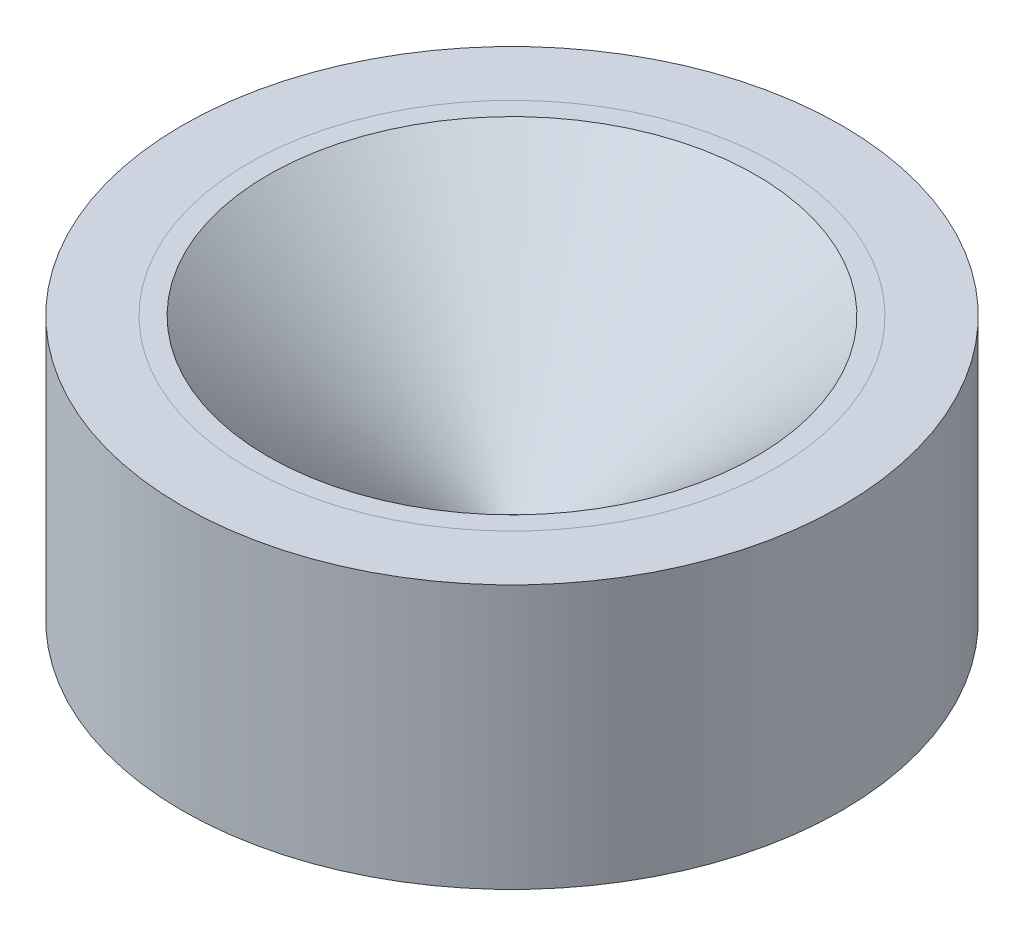
ISO-10303-21;
HEADER;
FILE_DESCRIPTION(('STEP AP214'),'2;1');
FILE_NAME('part.step','',(''),(''),'','','');
FILE_SCHEMA(('AUTOMOTIVE_DESIGN { 1 0 10303 214 1 1 1 1 }'));
ENDSEC;
DATA;
#1=APPLICATION_CONTEXT('core data for automotive mechanical design processes');
#2=APPLICATION_PROTOCOL_DEFINITION('international standard','automotive_design',2000,#1);
#3=PRODUCT_CONTEXT('',#1,'mechanical');
#4=PRODUCT('Part','Part','',(#3));
#5=PRODUCT_RELATED_PRODUCT_CATEGORY('part','',(#4));
#6=PRODUCT_DEFINITION_FORMATION('','',#4);
#7=PRODUCT_DEFINITION_CONTEXT('part definition',#1,'design');
#8=PRODUCT_DEFINITION('design','',#6,#7);
#9=PRODUCT_DEFINITION_SHAPE('','',#8);
#10=(LENGTH_UNIT() NAMED_UNIT(*) SI_UNIT(.MILLI.,.METRE.));
#11=(NAMED_UNIT(*) PLANE_ANGLE_UNIT() SI_UNIT($,.RADIAN.));
#12=(NAMED_UNIT(*) SI_UNIT($,.STERADIAN.) SOLID_ANGLE_UNIT());
#13=UNCERTAINTY_MEASURE_WITH_UNIT(LENGTH_MEASURE(1.E-05),#10,'distance_accuracy_value','');
#14=(GEOMETRIC_REPRESENTATION_CONTEXT(3) GLOBAL_UNCERTAINTY_ASSIGNED_CONTEXT((#13)) GLOBAL_UNIT_ASSIGNED_CONTEXT((#10,
#11,#12)) REPRESENTATION_CONTEXT('',''));
#15=CARTESIAN_POINT('',(0.,0.,0.));
#16=DIRECTION('',(0.,0.,1.));
#17=DIRECTION('',(1.,0.,0.));
#18=AXIS2_PLACEMENT_3D('',#15,#16,#17);
#19=CARTESIAN_POINT('',(0.,1.,0.));
#20=DIRECTION('',(0.,-1.,0.));
#21=DIRECTION('',(0.,0.,-1.));
#22=AXIS2_PLACEMENT_3D('',#19,#20,#21);
#23=CYLINDRICAL_SURFACE('',#22,0.625);
#24=CARTESIAN_POINT('',(0.,1.,0.));
#25=DIRECTION('',(0.,1.,0.));
#26=DIRECTION('',(0.,0.,1.));
#27=AXIS2_PLACEMENT_3D('',#24,#25,#26);
#28=CIRCLE('',#27,0.625);
#29=CARTESIAN_POINT('',(0.,1.,0.625));
#30=VERTEX_POINT('',#29);
#31=EDGE_CURVE('E61',#30,#30,#28,.T.);
#32=ORIENTED_EDGE('',*,*,#31,.F.);
#33=EDGE_LOOP('',(#32));
#34=FACE_BOUND('',#33,.T.);
#35=CARTESIAN_POINT('',(0.,0.,0.));
#36=DIRECTION('',(0.,-1.,0.));
#37=DIRECTION('',(0.,0.,-1.));
#38=AXIS2_PLACEMENT_3D('',#35,#36,#37);
#39=CIRCLE('',#38,0.625);
#40=CARTESIAN_POINT('',(0.,0.,-0.625));
#41=VERTEX_POINT('',#40);
#42=EDGE_CURVE('E12',#41,#41,#39,.T.);
#43=ORIENTED_EDGE('',*,*,#42,.F.);
#44=EDGE_LOOP('',(#43));
#45=FACE_BOUND('',#44,.T.);
#46=ADVANCED_FACE('F57',(#34,#45),#23,.T.);
#47=CARTESIAN_POINT('',(0.,0.,0.));
#48=DIRECTION('',(0.,-1.,0.));
#49=DIRECTION('',(0.,0.,-1.));
#50=AXIS2_PLACEMENT_3D('',#47,#48,#49);
#51=PLANE('',#50);
#52=CARTESIAN_POINT('',(0.,0.,0.));
#53=DIRECTION('',(0.,-1.,0.));
#54=DIRECTION('',(0.,0.,-1.));
#55=AXIS2_PLACEMENT_3D('',#52,#53,#54);
#56=CIRCLE('',#55,0.5);
#57=CARTESIAN_POINT('',(0.,0.,-0.5));
#58=VERTEX_POINT('',#57);
#59=EDGE_CURVE('E71',#58,#58,#56,.T.);
#60=ORIENTED_EDGE('',*,*,#59,.F.);
#61=EDGE_LOOP('',(#60));
#62=FACE_BOUND('',#61,.T.);
#63=ORIENTED_EDGE('',*,*,#42,.T.);
#64=EDGE_LOOP('',(#63));
#65=FACE_BOUND('',#64,.T.);
#66=ADVANCED_FACE('F160',(#62,#65),#51,.T.);
#67=CARTESIAN_POINT('',(0.,1.,0.));
#68=DIRECTION('',(0.,-1.,0.));
#69=DIRECTION('',(0.,0.,-1.));
#70=AXIS2_PLACEMENT_3D('',#67,#68,#69);
#71=CYLINDRICAL_SURFACE('',#70,0.5);
#72=CARTESIAN_POINT('',(0.,1.,0.));
#73=DIRECTION('',(0.,-1.,0.));
#74=DIRECTION('',(0.,0.,-1.));
#75=AXIS2_PLACEMENT_3D('',#72,#73,#74);
#76=CIRCLE('',#75,0.5);
#77=CARTESIAN_POINT('',(0.,1.,-0.5));
#78=VERTEX_POINT('',#77);
#79=EDGE_CURVE('E66',#78,#78,#76,.T.);
#80=ORIENTED_EDGE('',*,*,#79,.F.);
#81=EDGE_LOOP('',(#80));
#82=FACE_BOUND('',#81,.T.);
#83=ORIENTED_EDGE('',*,*,#59,.T.);
#84=EDGE_LOOP('',(#83));
#85=FACE_BOUND('',#84,.T.);
#86=ADVANCED_FACE('F165',(#82,#85),#71,.F.);
#87=CARTESIAN_POINT('',(0.,1.,0.));
#88=DIRECTION('',(0.,1.,0.));
#89=DIRECTION('',(0.,0.,1.));
#90=AXIS2_PLACEMENT_3D('',#87,#88,#89);
#91=PLANE('',#90);
#92=CARTESIAN_POINT('',(0.,1.,0.));
#93=DIRECTION('',(0.,1.,0.));
#94=DIRECTION('',(0.,0.,1.));
#95=AXIS2_PLACEMENT_3D('',#92,#93,#94);
#96=CIRCLE('',#95,0.425);
#97=CARTESIAN_POINT('',(0.,1.,0.425));
#98=VERTEX_POINT('',#97);
#99=EDGE_CURVE('E91',#98,#98,#96,.T.);
#100=ORIENTED_EDGE('',*,*,#99,.T.);
#101=EDGE_LOOP('',(#100));
#102=FACE_BOUND('',#101,.T.);
#103=ORIENTED_EDGE('',*,*,#79,.T.);
#104=EDGE_LOOP('',(#103));
#105=FACE_BOUND('',#104,.T.);
#106=ADVANCED_FACE('F118',(#102,#105),#91,.F.);
#107=CARTESIAN_POINT('',(0.,4.,0.));
#108=DIRECTION('',(0.,1.,0.));
#109=DIRECTION('',(0.,0.,1.));
#110=AXIS2_PLACEMENT_3D('',#107,#108,#109);
#111=PLANE('',#110);
#112=CARTESIAN_POINT('',(0.,4.,0.));
#113=DIRECTION('',(0.,1.,0.));
#114=DIRECTION('',(0.,0.,1.));
#115=AXIS2_PLACEMENT_3D('',#112,#113,#114);
#116=CIRCLE('',#115,3.69896013553019);
#117=CARTESIAN_POINT('',(0.,4.,3.69896013553019));
#118=VERTEX_POINT('',#117);
#119=EDGE_CURVE('E146',#118,#118,#116,.T.);
#120=ORIENTED_EDGE('',*,*,#119,.F.);
#121=EDGE_LOOP('',(#120));
#122=FACE_BOUND('',#121,.T.);
#123=CARTESIAN_POINT('',(0.,4.,0.));
#124=DIRECTION('',(0.,1.,0.));
#125=DIRECTION('',(0.,0.,1.));
#126=AXIS2_PLACEMENT_3D('',#123,#124,#125);
#127=CIRCLE('',#126,4.);
#128=CARTESIAN_POINT('',(0.,4.,4.));
#129=VERTEX_POINT('',#128);
#130=EDGE_CURVE('E88',#129,#129,#127,.T.);
#131=ORIENTED_EDGE('',*,*,#130,.T.);
#132=EDGE_LOOP('',(#131));
#133=FACE_BOUND('',#132,.T.);
#134=ADVANCED_FACE('F107',(#122,#133),#111,.T.);
#135=CARTESIAN_POINT('',(0.,1.,0.));
#136=DIRECTION('',(0.,1.,0.));
#137=DIRECTION('',(0.,0.,1.));
#138=AXIS2_PLACEMENT_3D('',#135,#136,#137);
#139=CONICAL_SURFACE('',#138,0.625,0.844153986113171);
#140=CARTESIAN_POINT('',(0.,4.,4.));
#141=CARTESIAN_POINT('',(0.,3.96875,3.96484375));
#142=CARTESIAN_POINT('',(0.,3.9375,3.9296875));
#143=CARTESIAN_POINT('',(0.,3.875,3.859375));
#144=CARTESIAN_POINT('',(0.,3.84375,3.82421875));
#145=CARTESIAN_POINT('',(0.,3.78125,3.75390625));
#146=CARTESIAN_POINT('',(0.,3.75,3.71875));
#147=CARTESIAN_POINT('',(0.,3.6875,3.6484375));
#148=CARTESIAN_POINT('',(0.,3.65625,3.61328125));
#149=CARTESIAN_POINT('',(0.,3.59375,3.54296875));
#150=CARTESIAN_POINT('',(0.,3.5625,3.5078125));
#151=CARTESIAN_POINT('',(0.,3.5,3.4375));
#152=CARTESIAN_POINT('',(0.,3.46875,3.40234375));
#153=CARTESIAN_POINT('',(0.,3.40625,3.33203125));
#154=CARTESIAN_POINT('',(0.,3.375,3.296875));
#155=CARTESIAN_POINT('',(0.,3.3125,3.2265625));
#156=CARTESIAN_POINT('',(0.,3.28125,3.19140625));
#157=CARTESIAN_POINT('',(0.,3.21875,3.12109375));
#158=CARTESIAN_POINT('',(0.,3.1875,3.0859375));
#159=CARTESIAN_POINT('',(0.,3.125,3.015625));
#160=CARTESIAN_POINT('',(0.,3.09375,2.98046875));
#161=CARTESIAN_POINT('',(0.,3.03125,2.91015625));
#162=CARTESIAN_POINT('',(0.,3.,2.875));
#163=CARTESIAN_POINT('',(0.,2.9375,2.8046875));
#164=CARTESIAN_POINT('',(0.,2.90625,2.76953125));
#165=CARTESIAN_POINT('',(0.,2.84375,2.69921875));
#166=CARTESIAN_POINT('',(0.,2.8125,2.6640625));
#167=CARTESIAN_POINT('',(0.,2.75,2.59375));
#168=CARTESIAN_POINT('',(0.,2.71875,2.55859375));
#169=CARTESIAN_POINT('',(0.,2.65625,2.48828125));
#170=CARTESIAN_POINT('',(0.,2.625,2.453125));
#171=CARTESIAN_POINT('',(0.,2.5625,2.3828125));
#172=CARTESIAN_POINT('',(0.,2.53125,2.34765625));
#173=CARTESIAN_POINT('',(0.,2.46875,2.27734375));
#174=CARTESIAN_POINT('',(0.,2.4375,2.2421875));
#175=CARTESIAN_POINT('',(0.,2.375,2.171875));
#176=CARTESIAN_POINT('',(0.,2.34375,2.13671875));
#177=CARTESIAN_POINT('',(0.,2.28125,2.06640625));
#178=CARTESIAN_POINT('',(0.,2.25,2.03125));
#179=CARTESIAN_POINT('',(0.,2.1875,1.9609375));
#180=CARTESIAN_POINT('',(0.,2.15625,1.92578125));
#181=CARTESIAN_POINT('',(0.,2.09375,1.85546875));
#182=CARTESIAN_POINT('',(0.,2.0625,1.8203125));
#183=CARTESIAN_POINT('',(0.,2.,1.75));
#184=CARTESIAN_POINT('',(0.,1.96875,1.71484375));
#185=CARTESIAN_POINT('',(0.,1.90625,1.64453125));
#186=CARTESIAN_POINT('',(0.,1.875,1.609375));
#187=CARTESIAN_POINT('',(0.,1.8125,1.5390625));
#188=CARTESIAN_POINT('',(0.,1.78125,1.50390625));
#189=CARTESIAN_POINT('',(0.,1.71875,1.43359375));
#190=CARTESIAN_POINT('',(0.,1.6875,1.3984375));
#191=CARTESIAN_POINT('',(0.,1.625,1.328125));
#192=CARTESIAN_POINT('',(0.,1.59375,1.29296875));
#193=CARTESIAN_POINT('',(0.,1.53125,1.22265625));
#194=CARTESIAN_POINT('',(0.,1.5,1.1875));
#195=CARTESIAN_POINT('',(0.,1.4375,1.1171875));
#196=CARTESIAN_POINT('',(0.,1.40625,1.08203125));
#197=CARTESIAN_POINT('',(0.,1.34375,1.01171875));
#198=CARTESIAN_POINT('',(0.,1.3125,0.9765625));
#199=CARTESIAN_POINT('',(0.,1.25,0.90625));
#200=CARTESIAN_POINT('',(0.,1.21875,0.87109375));
#201=CARTESIAN_POINT('',(0.,1.15625,0.80078125));
#202=CARTESIAN_POINT('',(0.,1.125,0.765625));
#203=CARTESIAN_POINT('',(0.,1.0625,0.6953125));
#204=CARTESIAN_POINT('',(0.,1.03125,0.66015625));
#205=CARTESIAN_POINT('',(0.,1.,0.625));
#206=B_SPLINE_CURVE_WITH_KNOTS('',3,(#140,#141,#142,#143,#144,#145,#146,#147,#148,#149,#150,
#151,#152,#153,#154,#155,#156,#157,#158,#159,#160,#161,#162,#163,#164,#165,#166,#167,#168,#169,
#170,#171,#172,#173,#174,#175,#176,#177,#178,#179,#180,#181,#182,#183,#184,#185,#186,#187,#188,
#189,#190,#191,#192,#193,#194,#195,#196,#197,#198,#199,#200,#201,#202,#203,#204,#205),
.UNSPECIFIED.,.F.,.F.,(4,2,2,2,2,2,2,2,2,2,2,2,2,2,2,2,2,2,2,2,2,2,2,2,2,2,2,2,2,2,2,2,4),(0.,
0.141112436470222,0.282224872940445,0.423337309410666,0.564449745880889,0.705562182351111,
0.846674618821333,0.987787055291555,1.12889949176178,1.270011928232,1.41112436470222,
1.55223680117244,1.69334923764267,1.83446167411289,1.97557411058311,2.11668654705333,
2.25779898352355,2.39891141999378,2.540023856464,2.68113629293422,2.82224872940444,
2.96336116587467,3.10447360234489,3.24558603881511,3.38669847528533,3.52781091175555,
3.66892334822578,3.810035784696,3.95114822116622,4.09226065763644,4.23337309410667,
4.37448553057689,4.51559796704711),.UNSPECIFIED.);
#207=EDGE_CURVE('BSEAM117',#129,#30,#206,.T.);
#208=ORIENTED_EDGE('',*,*,#130,.F.);
#209=ORIENTED_EDGE('',*,*,#31,.T.);
#210=ORIENTED_EDGE('',*,*,#207,.T.);
#211=ORIENTED_EDGE('',*,*,#207,.F.);
#212=EDGE_LOOP('',(#208,#210,#209,#211));
#213=FACE_BOUND('',#212,.T.);
#214=ADVANCED_FACE('F117',(#213),#139,.T.);
#215=CARTESIAN_POINT('',(0.,1.,0.));
#216=DIRECTION('',(0.,-1.,0.));
#217=DIRECTION('',(0.,0.,-1.));
#218=AXIS2_PLACEMENT_3D('',#215,#216,#217);
#219=CYLINDRICAL_SURFACE('',#218,0.425);
#220=CARTESIAN_POINT('',(0.,1.08981321286205,0.));
#221=DIRECTION('',(0.,1.,0.));
#222=DIRECTION('',(0.,0.,1.));
#223=AXIS2_PLACEMENT_3D('',#220,#221,#222);
#224=CIRCLE('',#223,0.425);
#225=CARTESIAN_POINT('',(0.,1.08981321286205,0.425));
#226=VERTEX_POINT('',#225);
#227=EDGE_CURVE('E97',#226,#226,#224,.T.);
#228=ORIENTED_EDGE('',*,*,#227,.T.);
#229=EDGE_LOOP('',(#228));
#230=FACE_BOUND('',#229,.T.);
#231=ORIENTED_EDGE('',*,*,#99,.F.);
#232=EDGE_LOOP('',(#231));
#233=FACE_BOUND('',#232,.T.);
#234=ADVANCED_FACE('F125',(#230,#233),#219,.F.);
#235=CARTESIAN_POINT('',(0.,1.14948186373673,0.));
#236=DIRECTION('',(0.,1.,0.));
#237=DIRECTION('',(0.,0.,1.));
#238=AXIS2_PLACEMENT_3D('',#235,#236,#237);
#239=CONICAL_SURFACE('',#238,0.492127232234016,0.844153986113171);
#240=CARTESIAN_POINT('',(0.,4.,3.69896013553019));
#241=CARTESIAN_POINT('',(0.,3.96968555430065,3.66485638411842));
#242=CARTESIAN_POINT('',(0.,3.93937110860129,3.63075263270665));
#243=CARTESIAN_POINT('',(0.,3.87874221720259,3.5625451298831));
#244=CARTESIAN_POINT('',(0.,3.84842777150323,3.52844137847133));
#245=CARTESIAN_POINT('',(0.,3.78779888010452,3.46023387564778));
#246=CARTESIAN_POINT('',(0.,3.75748443440517,3.42613012423601));
#247=CARTESIAN_POINT('',(0.,3.69685554300646,3.35792262141246));
#248=CARTESIAN_POINT('',(0.,3.66654109730711,3.32381887000069));
#249=CARTESIAN_POINT('',(0.,3.6059122059084,3.25561136717715));
#250=CARTESIAN_POINT('',(0.,3.57559776020905,3.22150761576537));
#251=CARTESIAN_POINT('',(0.,3.51496886881034,3.15330011294183));
#252=CARTESIAN_POINT('',(0.,3.48465442311099,3.11919636153005));
#253=CARTESIAN_POINT('',(0.,3.42402553171228,3.05098885870651));
#254=CARTESIAN_POINT('',(0.,3.39371108601293,3.01688510729474));
#255=CARTESIAN_POINT('',(0.,3.33308219461422,2.94867760447119));
#256=CARTESIAN_POINT('',(0.,3.30276774891487,2.91457385305942));
#257=CARTESIAN_POINT('',(0.,3.24213885751616,2.84636635023587));
#258=CARTESIAN_POINT('',(0.,3.21182441181681,2.8122625988241));
#259=CARTESIAN_POINT('',(0.,3.1511955204181,2.74405509600055));
#260=CARTESIAN_POINT('',(0.,3.12088107471874,2.70995134458878));
#261=CARTESIAN_POINT('',(0.,3.06025218332004,2.64174384176523));
#262=CARTESIAN_POINT('',(0.,3.02993773762068,2.60764009035346));
#263=CARTESIAN_POINT('',(0.,2.96930884622198,2.53943258752992));
#264=CARTESIAN_POINT('',(0.,2.93899440052262,2.50532883611814));
#265=CARTESIAN_POINT('',(0.,2.87836550912392,2.4371213332946));
#266=CARTESIAN_POINT('',(0.,2.84805106342456,2.40301758188282));
#267=CARTESIAN_POINT('',(0.,2.78742217202585,2.33481007905928));
#268=CARTESIAN_POINT('',(0.,2.7571077263265,2.30070632764751));
#269=CARTESIAN_POINT('',(0.,2.69647883492779,2.23249882482396));
#270=CARTESIAN_POINT('',(0.,2.66616438922844,2.19839507341219));
#271=CARTESIAN_POINT('',(0.,2.60553549782973,2.13018757058864));
#272=CARTESIAN_POINT('',(0.,2.57522105213038,2.09608381917687));
#273=CARTESIAN_POINT('',(0.,2.51459216073167,2.02787631635332));
#274=CARTESIAN_POINT('',(0.,2.48427771503232,1.99377256494155));
#275=CARTESIAN_POINT('',(0.,2.42364882363361,1.925565062118));
#276=CARTESIAN_POINT('',(0.,2.39333437793426,1.89146131070623));
#277=CARTESIAN_POINT('',(0.,2.33270548653555,1.82325380788269));
#278=CARTESIAN_POINT('',(0.,2.3023910408362,1.78915005647091));
#279=CARTESIAN_POINT('',(0.,2.24176214943749,1.72094255364737));
#280=CARTESIAN_POINT('',(0.,2.21144770373814,1.68683880223559));
#281=CARTESIAN_POINT('',(0.,2.15081881233943,1.61863129941205));
#282=CARTESIAN_POINT('',(0.,2.12050436664007,1.58452754800028));
#283=CARTESIAN_POINT('',(0.,2.05987547524137,1.51632004517673));
#284=CARTESIAN_POINT('',(0.,2.02956102954201,1.48221629376496));
#285=CARTESIAN_POINT('',(0.,1.96893213814331,1.41400879094141));
#286=CARTESIAN_POINT('',(0.,1.93861769244395,1.37990503952964));
#287=CARTESIAN_POINT('',(0.,1.87798880104525,1.31169753670609));
#288=CARTESIAN_POINT('',(0.,1.84767435534589,1.27759378529432));
#289=CARTESIAN_POINT('',(0.,1.78704546394718,1.20938628247078));
#290=CARTESIAN_POINT('',(0.,1.75673101824783,1.175282531059));
#291=CARTESIAN_POINT('',(0.,1.69610212684912,1.10707502823546));
#292=CARTESIAN_POINT('',(0.,1.66578768114977,1.07297127682368));
#293=CARTESIAN_POINT('',(0.,1.60515878975106,1.00476377400014));
#294=CARTESIAN_POINT('',(0.,1.57484434405171,0.970660022588365));
#295=CARTESIAN_POINT('',(0.,1.514215452653,0.90245251976482));
#296=CARTESIAN_POINT('',(0.,1.48390100695365,0.868348768353047));
#297=CARTESIAN_POINT('',(0.,1.42327211555494,0.800141265529501));
#298=CARTESIAN_POINT('',(0.,1.39295766985559,0.766037514117728));
#299=CARTESIAN_POINT('',(0.,1.33232877845688,0.697830011294182));
#300=CARTESIAN_POINT('',(0.,1.30201433275753,0.66372625988241));
#301=CARTESIAN_POINT('',(0.,1.24138544135882,0.595518757058864));
#302=CARTESIAN_POINT('',(0.,1.21107099565947,0.561415005647091));
#303=CARTESIAN_POINT('',(0.,1.15044210426076,0.493207502823545));
#304=CARTESIAN_POINT('',(0.,1.1201276585614,0.459103751411773));
#305=CARTESIAN_POINT('',(0.,1.08981321286205,0.425));
#306=B_SPLINE_CURVE_WITH_KNOTS('',3,(#240,#241,#242,#243,#244,#245,#246,#247,#248,#249,#250,
#251,#252,#253,#254,#255,#256,#257,#258,#259,#260,#261,#262,#263,#264,#265,#266,#267,#268,#269,
#270,#271,#272,#273,#274,#275,#276,#277,#278,#279,#280,#281,#282,#283,#284,#285,#286,#287,#288,
#289,#290,#291,#292,#293,#294,#295,#296,#297,#298,#299,#300,#301,#302,#303,#304,#305),
.UNSPECIFIED.,.F.,.F.,(4,2,2,2,2,2,2,2,2,2,2,2,2,2,2,2,2,2,2,2,2,2,2,2,2,2,2,2,2,2,2,2,4),(0.,
0.136887849372161,0.273775698744322,0.410663548116484,0.547551397488645,0.684439246860807,
0.821327096232968,0.95821494560513,1.09510279497729,1.23199064434945,1.36887849372161,
1.50576634309377,1.64265419246594,1.7795420418381,1.91642989121026,2.05331774058242,
2.19020558995458,2.32709343932674,2.4639812886989,2.60086913807106,2.73775698744323,
2.87464483681539,3.01153268618755,3.14842053555971,3.28530838493187,3.42219623430403,
3.55908408367619,3.69597193304835,3.83285978242052,3.96974763179268,4.10663548116484,
4.243523330537,4.38041117990916),.UNSPECIFIED.);
#307=EDGE_CURVE('BSEAM120',#118,#226,#306,.T.);
#308=ORIENTED_EDGE('',*,*,#119,.T.);
#309=ORIENTED_EDGE('',*,*,#227,.F.);
#310=ORIENTED_EDGE('',*,*,#307,.T.);
#311=ORIENTED_EDGE('',*,*,#307,.F.);
#312=EDGE_LOOP('',(#308,#310,#309,#311));
#313=FACE_BOUND('',#312,.T.);
#314=ADVANCED_FACE('F120',(#313),#239,.F.);
#315=CLOSED_SHELL('',(#46,#66,#86,#106,#134,#214,#234,#314));
#316=MANIFOLD_SOLID_BREP('B2',#315);
#317=CARTESIAN_POINT('',(0.,4.,0.));
#318=DIRECTION('',(0.,1.,0.));
#319=DIRECTION('',(0.,0.,1.));
#320=AXIS2_PLACEMENT_3D('',#317,#318,#319);
#321=PLANE('',#320);
#322=CARTESIAN_POINT('',(0.,4.,0.));
#323=DIRECTION('',(0.,1.,0.));
#324=DIRECTION('',(0.,0.,1.));
#325=AXIS2_PLACEMENT_3D('',#322,#323,#324);
#326=CIRCLE('',#325,5.);
#327=CARTESIAN_POINT('',(0.,4.,5.));
#328=VERTEX_POINT('',#327);
#329=EDGE_CURVE('E238',#328,#328,#326,.T.);
#330=ORIENTED_EDGE('',*,*,#329,.T.);
#331=EDGE_LOOP('',(#330));
#332=FACE_BOUND('',#331,.T.);
#333=CARTESIAN_POINT('',(0.,4.,0.));
#334=DIRECTION('',(0.,1.,0.));
#335=DIRECTION('',(0.,0.,1.));
#336=AXIS2_PLACEMENT_3D('',#333,#334,#335);
#337=CIRCLE('',#336,4.);
#338=CARTESIAN_POINT('',(0.,4.,4.));
#339=VERTEX_POINT('',#338);
#340=EDGE_CURVE('E56',#339,#339,#337,.T.);
#341=ORIENTED_EDGE('',*,*,#340,.F.);
#342=EDGE_LOOP('',(#341));
#343=FACE_BOUND('',#342,.T.);
#344=ADVANCED_FACE('F223',(#332,#343),#321,.T.);
#345=CARTESIAN_POINT('',(0.,0.,0.));
#346=DIRECTION('',(0.,1.,0.));
#347=DIRECTION('',(0.,0.,1.));
#348=AXIS2_PLACEMENT_3D('',#345,#346,#347);
#349=PLANE('',#348);
#350=CARTESIAN_POINT('',(0.,0.,0.));
#351=DIRECTION('',(0.,1.,0.));
#352=DIRECTION('',(0.,0.,1.));
#353=AXIS2_PLACEMENT_3D('',#350,#351,#352);
#354=CIRCLE('',#353,5.);
#355=CARTESIAN_POINT('',(0.,0.,5.));
#356=VERTEX_POINT('',#355);
#357=EDGE_CURVE('E229',#356,#356,#354,.T.);
#358=ORIENTED_EDGE('',*,*,#357,.F.);
#359=EDGE_LOOP('',(#358));
#360=FACE_BOUND('',#359,.T.);
#361=CARTESIAN_POINT('',(0.,0.,0.));
#362=DIRECTION('',(0.,1.,0.));
#363=DIRECTION('',(0.,0.,1.));
#364=AXIS2_PLACEMENT_3D('',#361,#362,#363);
#365=CIRCLE('',#364,4.);
#366=CARTESIAN_POINT('',(0.,0.,4.));
#367=VERTEX_POINT('',#366);
#368=EDGE_CURVE('E233',#367,#367,#365,.T.);
#369=ORIENTED_EDGE('',*,*,#368,.T.);
#370=EDGE_LOOP('',(#369));
#371=FACE_BOUND('',#370,.T.);
#372=ADVANCED_FACE('F248',(#360,#371),#349,.F.);
#373=CARTESIAN_POINT('',(0.,4.,0.));
#374=DIRECTION('',(0.,-1.,0.));
#375=DIRECTION('',(0.,0.,-1.));
#376=AXIS2_PLACEMENT_3D('',#373,#374,#375);
#377=CYLINDRICAL_SURFACE('',#376,5.);
#378=ORIENTED_EDGE('',*,*,#329,.F.);
#379=EDGE_LOOP('',(#378));
#380=FACE_BOUND('',#379,.T.);
#381=ORIENTED_EDGE('',*,*,#357,.T.);
#382=EDGE_LOOP('',(#381));
#383=FACE_BOUND('',#382,.T.);
#384=ADVANCED_FACE('F245',(#380,#383),#377,.T.);
#385=CARTESIAN_POINT('',(0.,4.,0.));
#386=DIRECTION('',(0.,-1.,0.));
#387=DIRECTION('',(0.,0.,-1.));
#388=AXIS2_PLACEMENT_3D('',#385,#386,#387);
#389=CYLINDRICAL_SURFACE('',#388,4.);
#390=ORIENTED_EDGE('',*,*,#340,.T.);
#391=EDGE_LOOP('',(#390));
#392=FACE_BOUND('',#391,.T.);
#393=ORIENTED_EDGE('',*,*,#368,.F.);
#394=EDGE_LOOP('',(#393));
#395=FACE_BOUND('',#394,.T.);
#396=ADVANCED_FACE('F247',(#392,#395),#389,.F.);
#397=CLOSED_SHELL('',(#344,#372,#384,#396));
#398=MANIFOLD_SOLID_BREP('B7',#397);
#399=ADVANCED_BREP_SHAPE_REPRESENTATION('',(#18,#316,#398),#14);
#400=SHAPE_DEFINITION_REPRESENTATION(#9,#399);
ENDSEC;
END-ISO-10303-21;
